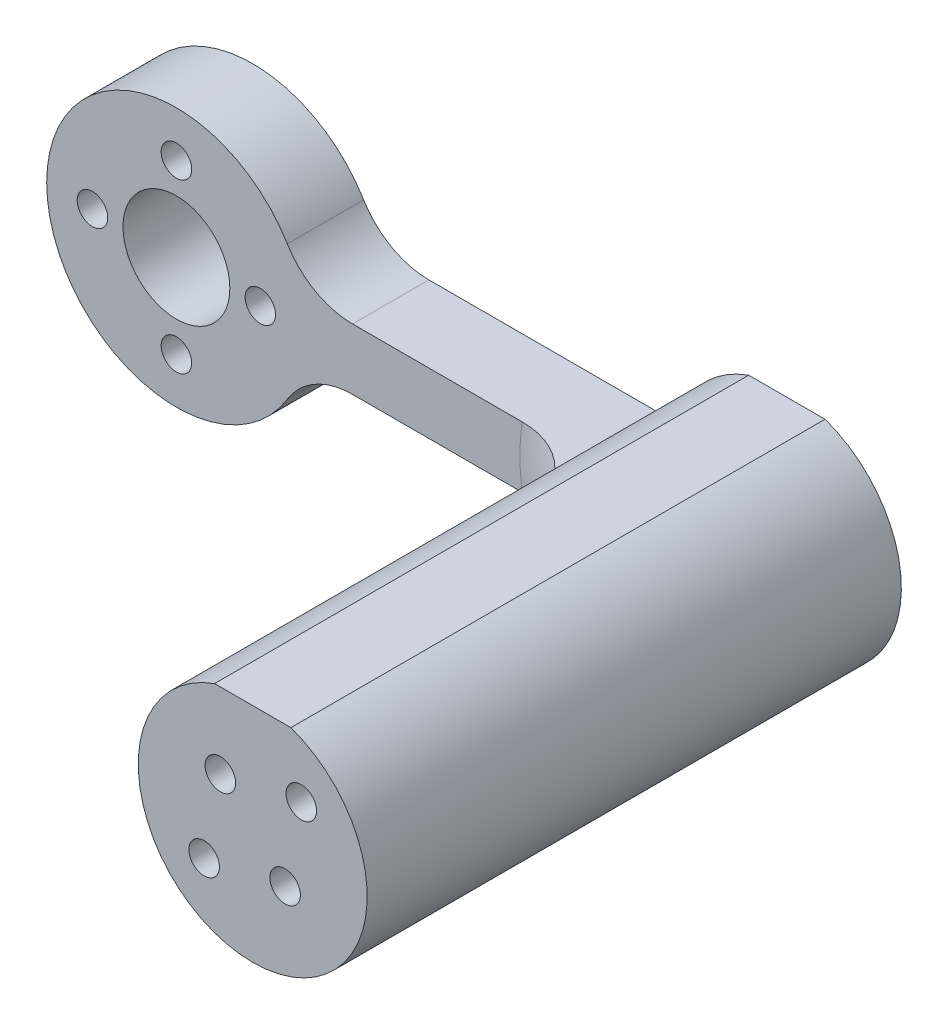
ISO-10303-21;
HEADER;
FILE_DESCRIPTION(('STEP AP214'),'2;1');
FILE_NAME('part.step','',(''),(''),'','','');
FILE_SCHEMA(('AUTOMOTIVE_DESIGN { 1 0 10303 214 1 1 1 1 }'));
ENDSEC;
DATA;
#1=APPLICATION_CONTEXT('core data for automotive mechanical design processes');
#2=APPLICATION_PROTOCOL_DEFINITION('international standard','automotive_design',2000,#1);
#3=PRODUCT_CONTEXT('',#1,'mechanical');
#4=PRODUCT('Part','Part','',(#3));
#5=PRODUCT_RELATED_PRODUCT_CATEGORY('part','',(#4));
#6=PRODUCT_DEFINITION_FORMATION('','',#4);
#7=PRODUCT_DEFINITION_CONTEXT('part definition',#1,'design');
#8=PRODUCT_DEFINITION('design','',#6,#7);
#9=PRODUCT_DEFINITION_SHAPE('','',#8);
#10=(LENGTH_UNIT() NAMED_UNIT(*) SI_UNIT(.MILLI.,.METRE.));
#11=(NAMED_UNIT(*) PLANE_ANGLE_UNIT() SI_UNIT($,.RADIAN.));
#12=(NAMED_UNIT(*) SI_UNIT($,.STERADIAN.) SOLID_ANGLE_UNIT());
#13=UNCERTAINTY_MEASURE_WITH_UNIT(LENGTH_MEASURE(1.E-05),#10,'distance_accuracy_value','');
#14=(GEOMETRIC_REPRESENTATION_CONTEXT(3) GLOBAL_UNCERTAINTY_ASSIGNED_CONTEXT((#13)) GLOBAL_UNIT_ASSIGNED_CONTEXT((#10,
#11,#12)) REPRESENTATION_CONTEXT('',''));
#15=CARTESIAN_POINT('',(0.,0.,0.));
#16=DIRECTION('',(0.,0.,1.));
#17=DIRECTION('',(1.,0.,0.));
#18=AXIS2_PLACEMENT_3D('',#15,#16,#17);
#19=CARTESIAN_POINT('',(0.,0.,10.));
#20=DIRECTION('',(0.,0.,-1.));
#21=DIRECTION('',(-1.,0.,0.));
#22=AXIS2_PLACEMENT_3D('',#19,#20,#21);
#23=CYLINDRICAL_SURFACE('',#22,17.);
#24=CARTESIAN_POINT('',(0.,0.,10.));
#25=DIRECTION('',(0.,0.,1.));
#26=DIRECTION('',(1.,0.,0.));
#27=AXIS2_PLACEMENT_3D('',#24,#25,#26);
#28=CIRCLE('',#27,17.);
#29=CARTESIAN_POINT('',(14.5361287755895,8.81481481481481,10.));
#30=VERTEX_POINT('',#29);
#31=CARTESIAN_POINT('',(14.5361287755895,-8.81481481481481,10.));
#32=VERTEX_POINT('',#31);
#33=EDGE_CURVE('E277',#30,#32,#28,.T.);
#34=ORIENTED_EDGE('',*,*,#33,.F.);
#35=DIRECTION('',(0.,0.,-1.));
#36=VECTOR('',#35,1.);
#37=CARTESIAN_POINT('',(14.5361287755895,8.81481481481481,10.));
#38=LINE('',#37,#36);
#39=CARTESIAN_POINT('',(14.5361287755895,8.81481481481481,0.));
#40=VERTEX_POINT('',#39);
#41=EDGE_CURVE('E260',#30,#40,#38,.T.);
#42=ORIENTED_EDGE('',*,*,#41,.T.);
#43=CARTESIAN_POINT('',(0.,0.,0.));
#44=DIRECTION('',(0.,0.,1.));
#45=DIRECTION('',(1.,0.,0.));
#46=AXIS2_PLACEMENT_3D('',#43,#44,#45);
#47=CIRCLE('',#46,17.);
#48=CARTESIAN_POINT('',(14.5361287755895,-8.81481481481481,0.));
#49=VERTEX_POINT('',#48);
#50=EDGE_CURVE('E140',#40,#49,#47,.T.);
#51=ORIENTED_EDGE('',*,*,#50,.T.);
#52=DIRECTION('',(0.,0.,-1.));
#53=VECTOR('',#52,1.);
#54=CARTESIAN_POINT('',(14.5361287755895,-8.81481481481481,10.));
#55=LINE('',#54,#53);
#56=EDGE_CURVE('E258',#49,#32,#55,.F.);
#57=ORIENTED_EDGE('',*,*,#56,.T.);
#58=EDGE_LOOP('',(#34,#42,#51,#57));
#59=FACE_BOUND('',#58,.T.);
#60=ADVANCED_FACE('F41',(#59),#23,.T.);
#61=CARTESIAN_POINT('',(0.,-4.,10.));
#62=DIRECTION('',(0.,1.,0.));
#63=DIRECTION('',(0.,0.,1.));
#64=AXIS2_PLACEMENT_3D('',#61,#62,#63);
#65=PLANE('',#64);
#66=DIRECTION('',(1.,0.,0.));
#67=VECTOR('',#66,1.);
#68=CARTESIAN_POINT('',(0.,-4.,10.));
#69=LINE('',#68,#67);
#70=CARTESIAN_POINT('',(23.0867927612304,-4.,10.));
#71=VERTEX_POINT('',#70);
#72=CARTESIAN_POINT('',(45.3220746414938,-4.,10.));
#73=VERTEX_POINT('',#72);
#74=EDGE_CURVE('E276',#71,#73,#69,.T.);
#75=ORIENTED_EDGE('',*,*,#74,.F.);
#76=DIRECTION('',(0.,0.,1.));
#77=VECTOR('',#76,1.);
#78=CARTESIAN_POINT('',(23.0867927612304,-4.,0.));
#79=LINE('',#78,#77);
#80=CARTESIAN_POINT('',(23.0867927612304,-4.,0.));
#81=VERTEX_POINT('',#80);
#82=EDGE_CURVE('E266',#71,#81,#79,.F.);
#83=ORIENTED_EDGE('',*,*,#82,.T.);
#84=DIRECTION('',(1.,0.,0.));
#85=VECTOR('',#84,1.);
#86=CARTESIAN_POINT('',(0.,-4.,0.));
#87=LINE('',#86,#85);
#88=CARTESIAN_POINT('',(55.543167705199,-4.00000000000001,0.));
#89=VERTEX_POINT('',#88);
#90=EDGE_CURVE('E138',#81,#89,#87,.T.);
#91=ORIENTED_EDGE('',*,*,#90,.T.);
#92=DIRECTION('',(0.,0.,-1.));
#93=VECTOR('',#92,1.);
#94=CARTESIAN_POINT('',(55.543167705199,-4.00000000000001,10.));
#95=LINE('',#94,#93);
#96=CARTESIAN_POINT('',(55.543167705199,-4.00000000000002,20.));
#97=VERTEX_POINT('',#96);
#98=EDGE_CURVE('E160',#97,#89,#95,.T.);
#99=ORIENTED_EDGE('',*,*,#98,.F.);
#100=CARTESIAN_POINT('',(55.543167705199,-4.00000000000002,20.));
#101=CARTESIAN_POINT('',(55.5432087449447,-4.00000000000001,19.7248228201258));
#102=CARTESIAN_POINT('',(55.5313843054158,-4.,19.4496563604906));
#103=CARTESIAN_POINT('',(55.4843057856862,-4.,18.9013784453921));
#104=CARTESIAN_POINT('',(55.4490555208303,-4.,18.6282666626093));
#105=CARTESIAN_POINT('',(55.3555207167676,-4.,18.0865864588528));
#106=CARTESIAN_POINT('',(55.297282684341,-4.,17.8180099993891));
#107=CARTESIAN_POINT('',(55.1583358704856,-4.,17.2867350727037));
#108=CARTESIAN_POINT('',(55.0776268110025,-4.,17.02403667826));
#109=CARTESIAN_POINT('',(54.8944992849666,-4.,16.5064127151429));
#110=CARTESIAN_POINT('',(54.792087302453,-4.,16.2514848508817));
#111=CARTESIAN_POINT('',(54.5663911555151,-4.,15.7509349786356));
#112=CARTESIAN_POINT('',(54.4430992887236,-4.,15.505316445832));
#113=CARTESIAN_POINT('',(54.1766885909717,-4.,15.0250785043264));
#114=CARTESIAN_POINT('',(54.0335694112606,-4.,14.7904592891932));
#115=CARTESIAN_POINT('',(53.7286257427785,-4.,14.3337002611693));
#116=CARTESIAN_POINT('',(53.5668003306246,-4.,14.1115610651261));
#117=CARTESIAN_POINT('',(53.2221724175061,-4.,13.6767489502417));
#118=CARTESIAN_POINT('',(53.039008900197,-4.,13.4643621422836));
#119=CARTESIAN_POINT('',(52.6558344622375,-4.,13.055375534902));
#120=CARTESIAN_POINT('',(52.4558233398176,-4.,12.8587759246035));
#121=CARTESIAN_POINT('',(52.0403418919247,-4.,12.4825608412591));
#122=CARTESIAN_POINT('',(51.8248681932299,-4.,12.3029490941134));
#123=CARTESIAN_POINT('',(51.3800007236259,-4.,11.9618900980499));
#124=CARTESIAN_POINT('',(51.1506069625836,-4.,11.8004428362567));
#125=CARTESIAN_POINT('',(50.6727665807411,-4.,11.4924240803305));
#126=CARTESIAN_POINT('',(50.4239641542808,-4.,11.3464041764122));
#127=CARTESIAN_POINT('',(49.9151283946834,-4.,11.0756910503394));
#128=CARTESIAN_POINT('',(49.6550988164515,-4.,10.9509907660192));
#129=CARTESIAN_POINT('',(49.1255786539551,-4.,10.7237379993877));
#130=CARTESIAN_POINT('',(48.8560898598838,-4.,10.6211813523012));
#131=CARTESIAN_POINT('',(48.309599607854,-4.,10.4389397848931));
#132=CARTESIAN_POINT('',(48.032599710736,-4.,10.3592501519706));
#133=CARTESIAN_POINT('',(47.3550666889493,-4.,10.1947068272554));
#134=CARTESIAN_POINT('',(46.9515431689588,-4.,10.1217588959313));
#135=CARTESIAN_POINT('',(46.3424238718643,-4.,10.0487528117809));
#136=CARTESIAN_POINT('',(46.1388276502254,-4.,10.0304867876077));
#137=CARTESIAN_POINT('',(45.7308663524651,-4.,10.006110608834));
#138=CARTESIAN_POINT('',(45.526501125084,-4.,10.0000029860478));
#139=CARTESIAN_POINT('',(45.3220746414938,-4.,10.));
#140=B_SPLINE_CURVE_WITH_KNOTS('',3,(#100,#101,#102,#103,#104,#105,#106,#107,#108,#109,#110,
#111,#112,#113,#114,#115,#116,#117,#118,#119,#120,#121,#122,#123,#124,#125,#126,#127,#128,#129,
#130,#131,#132,#133,#134,#135,#136,#137,#138,#139),.UNSPECIFIED.,.F.,.F.,(4,2,2,2,2,2,2,2,2,2,2,
2,2,2,2,2,2,2,2,4),(0.,0.82526128296588,1.65038818923651,2.47385425937608,3.29733051945721,
4.12056110094424,4.94409602757533,5.76764544154328,6.59123552518368,7.4316514340272,
8.27207740924713,9.11268728734717,9.9532965696039,10.8177407422021,11.6818980088234,
12.5458926029034,13.4097090105987,14.6365717240162,15.2495108816763,15.8625776618662),.UNSPECIFIED.);
#141=EDGE_CURVE('E169',#97,#73,#140,.T.);
#142=ORIENTED_EDGE('',*,*,#141,.T.);
#143=EDGE_LOOP('',(#75,#83,#91,#99,#142));
#144=FACE_BOUND('',#143,.T.);
#145=ADVANCED_FACE('F185',(#144),#65,.F.);
#146=CARTESIAN_POINT('',(70.,0.,10.));
#147=DIRECTION('',(0.,0.,-1.));
#148=DIRECTION('',(-1.,0.,0.));
#149=AXIS2_PLACEMENT_3D('',#146,#147,#148);
#150=CYLINDRICAL_SURFACE('',#149,15.0000000000001);
#151=CARTESIAN_POINT('',(70.,0.,20.));
#152=DIRECTION('',(0.,0.,1.));
#153=DIRECTION('',(1.,0.,0.));
#154=AXIS2_PLACEMENT_3D('',#151,#152,#153);
#155=CIRCLE('',#154,15.0000000000001);
#156=CARTESIAN_POINT('',(55.543167705199,4.00000000000001,20.));
#157=VERTEX_POINT('',#156);
#158=EDGE_CURVE('E164',#157,#97,#155,.T.);
#159=ORIENTED_EDGE('',*,*,#158,.T.);
#160=ORIENTED_EDGE('',*,*,#98,.T.);
#161=CARTESIAN_POINT('',(70.,0.,0.));
#162=DIRECTION('',(0.,0.,1.));
#163=DIRECTION('',(1.,0.,0.));
#164=AXIS2_PLACEMENT_3D('',#161,#162,#163);
#165=CIRCLE('',#164,15.0000000000001);
#166=CARTESIAN_POINT('',(75.,14.142135623731,0.));
#167=VERTEX_POINT('',#166);
#168=EDGE_CURVE('E137',#89,#167,#165,.T.);
#169=ORIENTED_EDGE('',*,*,#168,.T.);
#170=DIRECTION('',(0.,0.,1.));
#171=VECTOR('',#170,1.);
#172=CARTESIAN_POINT('',(75.,14.142135623731,0.));
#173=LINE('',#172,#171);
#174=CARTESIAN_POINT('',(75.,14.142135623731,70.));
#175=VERTEX_POINT('',#174);
#176=EDGE_CURVE('E116',#167,#175,#173,.T.);
#177=ORIENTED_EDGE('',*,*,#176,.T.);
#178=CARTESIAN_POINT('',(70.,0.,70.));
#179=DIRECTION('',(0.,0.,1.));
#180=DIRECTION('',(1.,0.,0.));
#181=AXIS2_PLACEMENT_3D('',#178,#179,#180);
#182=CIRCLE('',#181,15.0000000000001);
#183=CARTESIAN_POINT('',(65.,14.142135623731,70.));
#184=VERTEX_POINT('',#183);
#185=EDGE_CURVE('E131',#184,#175,#182,.T.);
#186=ORIENTED_EDGE('',*,*,#185,.F.);
#187=DIRECTION('',(0.,0.,1.));
#188=VECTOR('',#187,1.);
#189=CARTESIAN_POINT('',(65.,14.142135623731,0.));
#190=LINE('',#189,#188);
#191=CARTESIAN_POINT('',(65.,14.142135623731,0.));
#192=VERTEX_POINT('',#191);
#193=EDGE_CURVE('E113',#192,#184,#190,.T.);
#194=ORIENTED_EDGE('',*,*,#193,.F.);
#195=CARTESIAN_POINT('',(55.543167705199,4.00000000000001,0.));
#196=VERTEX_POINT('',#195);
#197=EDGE_CURVE('E128',#192,#196,#165,.T.);
#198=ORIENTED_EDGE('',*,*,#197,.T.);
#199=DIRECTION('',(0.,0.,-1.));
#200=VECTOR('',#199,1.);
#201=CARTESIAN_POINT('',(55.543167705199,4.00000000000001,10.));
#202=LINE('',#201,#200);
#203=EDGE_CURVE('E158',#157,#196,#202,.T.);
#204=ORIENTED_EDGE('',*,*,#203,.F.);
#205=EDGE_LOOP('',(#159,#160,#169,#177,#186,#194,#198,#204));
#206=FACE_BOUND('',#205,.T.);
#207=ADVANCED_FACE('F127',(#206),#150,.T.);
#208=CARTESIAN_POINT('',(74.2426406871193,-4.24264068711928,10.));
#209=DIRECTION('',(0.,0.,-1.));
#210=DIRECTION('',(-1.,0.,0.));
#211=AXIS2_PLACEMENT_3D('',#208,#209,#210);
#212=CYLINDRICAL_SURFACE('',#211,2.);
#213=CARTESIAN_POINT('',(74.2426406871193,-4.24264068711928,0.));
#214=DIRECTION('',(0.,0.,1.));
#215=DIRECTION('',(1.,0.,0.));
#216=AXIS2_PLACEMENT_3D('',#213,#214,#215);
#217=CIRCLE('',#216,2.);
#218=CARTESIAN_POINT('',(76.2426406871193,-4.24264068711928,0.));
#219=VERTEX_POINT('',#218);
#220=EDGE_CURVE('E151',#219,#219,#217,.T.);
#221=ORIENTED_EDGE('',*,*,#220,.F.);
#222=EDGE_LOOP('',(#221));
#223=FACE_BOUND('',#222,.T.);
#224=CARTESIAN_POINT('',(74.2426406871193,-4.24264068711928,70.));
#225=DIRECTION('',(0.,0.,1.));
#226=DIRECTION('',(1.,0.,0.));
#227=AXIS2_PLACEMENT_3D('',#224,#225,#226);
#228=CIRCLE('',#227,2.);
#229=CARTESIAN_POINT('',(76.2426406871193,-4.24264068711928,70.));
#230=VERTEX_POINT('',#229);
#231=EDGE_CURVE('E297',#230,#230,#228,.T.);
#232=ORIENTED_EDGE('',*,*,#231,.T.);
#233=EDGE_LOOP('',(#232));
#234=FACE_BOUND('',#233,.T.);
#235=ADVANCED_FACE('F331',(#223,#234),#212,.F.);
#236=CARTESIAN_POINT('',(63.6360389693211,-6.36396103067893,10.));
#237=DIRECTION('',(0.,0.,-1.));
#238=DIRECTION('',(-1.,0.,0.));
#239=AXIS2_PLACEMENT_3D('',#236,#237,#238);
#240=CYLINDRICAL_SURFACE('',#239,2.);
#241=CARTESIAN_POINT('',(63.6360389693211,-6.36396103067893,0.));
#242=DIRECTION('',(0.,0.,1.));
#243=DIRECTION('',(1.,0.,0.));
#244=AXIS2_PLACEMENT_3D('',#241,#242,#243);
#245=CIRCLE('',#244,2.);
#246=CARTESIAN_POINT('',(65.6360389693211,-6.36396103067893,0.));
#247=VERTEX_POINT('',#246);
#248=EDGE_CURVE('E148',#247,#247,#245,.T.);
#249=ORIENTED_EDGE('',*,*,#248,.F.);
#250=EDGE_LOOP('',(#249));
#251=FACE_BOUND('',#250,.T.);
#252=CARTESIAN_POINT('',(63.6360389693211,-6.36396103067893,70.));
#253=DIRECTION('',(0.,0.,1.));
#254=DIRECTION('',(1.,0.,0.));
#255=AXIS2_PLACEMENT_3D('',#252,#253,#254);
#256=CIRCLE('',#255,2.);
#257=CARTESIAN_POINT('',(65.6360389693211,-6.36396103067893,70.));
#258=VERTEX_POINT('',#257);
#259=EDGE_CURVE('E294',#258,#258,#256,.T.);
#260=ORIENTED_EDGE('',*,*,#259,.T.);
#261=EDGE_LOOP('',(#260));
#262=FACE_BOUND('',#261,.T.);
#263=ADVANCED_FACE('F322',(#251,#262),#240,.F.);
#264=CARTESIAN_POINT('',(65.7573593128807,4.24264068711929,10.));
#265=DIRECTION('',(0.,0.,-1.));
#266=DIRECTION('',(-1.,0.,0.));
#267=AXIS2_PLACEMENT_3D('',#264,#265,#266);
#268=CYLINDRICAL_SURFACE('',#267,2.);
#269=CARTESIAN_POINT('',(65.7573593128807,4.24264068711929,0.));
#270=DIRECTION('',(0.,0.,1.));
#271=DIRECTION('',(1.,0.,0.));
#272=AXIS2_PLACEMENT_3D('',#269,#270,#271);
#273=CIRCLE('',#272,2.);
#274=CARTESIAN_POINT('',(67.7573593128807,4.24264068711929,0.));
#275=VERTEX_POINT('',#274);
#276=EDGE_CURVE('E145',#275,#275,#273,.T.);
#277=ORIENTED_EDGE('',*,*,#276,.F.);
#278=EDGE_LOOP('',(#277));
#279=FACE_BOUND('',#278,.T.);
#280=CARTESIAN_POINT('',(65.7573593128807,4.24264068711929,70.));
#281=DIRECTION('',(0.,0.,1.));
#282=DIRECTION('',(1.,0.,0.));
#283=AXIS2_PLACEMENT_3D('',#280,#281,#282);
#284=CIRCLE('',#283,2.);
#285=CARTESIAN_POINT('',(67.7573593128807,4.24264068711929,70.));
#286=VERTEX_POINT('',#285);
#287=EDGE_CURVE('E303',#286,#286,#284,.T.);
#288=ORIENTED_EDGE('',*,*,#287,.T.);
#289=EDGE_LOOP('',(#288));
#290=FACE_BOUND('',#289,.T.);
#291=ADVANCED_FACE('F320',(#279,#290),#268,.F.);
#292=CARTESIAN_POINT('',(0.,4.,10.));
#293=DIRECTION('',(0.,1.,0.));
#294=DIRECTION('',(0.,0.,1.));
#295=AXIS2_PLACEMENT_3D('',#292,#293,#294);
#296=PLANE('',#295);
#297=DIRECTION('',(1.,0.,0.));
#298=VECTOR('',#297,1.);
#299=CARTESIAN_POINT('',(0.,4.,0.));
#300=LINE('',#299,#298);
#301=CARTESIAN_POINT('',(23.0867927612304,4.,0.));
#302=VERTEX_POINT('',#301);
#303=EDGE_CURVE('E136',#302,#196,#300,.T.);
#304=ORIENTED_EDGE('',*,*,#303,.F.);
#305=DIRECTION('',(0.,0.,-1.));
#306=VECTOR('',#305,1.);
#307=CARTESIAN_POINT('',(23.0867927612304,4.,10.));
#308=LINE('',#307,#306);
#309=CARTESIAN_POINT('',(23.0867927612304,4.,10.));
#310=VERTEX_POINT('',#309);
#311=EDGE_CURVE('E261',#302,#310,#308,.F.);
#312=ORIENTED_EDGE('',*,*,#311,.T.);
#313=DIRECTION('',(1.,0.,0.));
#314=VECTOR('',#313,1.);
#315=CARTESIAN_POINT('',(0.,4.,10.));
#316=LINE('',#315,#314);
#317=CARTESIAN_POINT('',(45.3220746414938,4.,10.));
#318=VERTEX_POINT('',#317);
#319=EDGE_CURVE('E161',#310,#318,#316,.T.);
#320=ORIENTED_EDGE('',*,*,#319,.T.);
#321=CARTESIAN_POINT('',(45.3220746414938,4.,10.));
#322=CARTESIAN_POINT('',(45.6124141063794,4.,9.99997007441533));
#323=CARTESIAN_POINT('',(45.9027435054448,4.,10.0123195296123));
#324=CARTESIAN_POINT('',(46.4812989688808,4.,10.0614910512002));
#325=CARTESIAN_POINT('',(46.7695252110759,4.,10.0983110237587));
#326=CARTESIAN_POINT('',(47.3416099272991,4.,10.196097931904));
#327=CARTESIAN_POINT('',(47.6254717477473,4.,10.25704529898));
#328=CARTESIAN_POINT('',(48.1870615965594,4.,10.4026010874903));
#329=CARTESIAN_POINT('',(48.4647896251705,4.,10.4872095079713));
#330=CARTESIAN_POINT('',(49.0122335736802,4.,10.6794901264012));
#331=CARTESIAN_POINT('',(49.2819471473328,4.,10.7871690039776));
#332=CARTESIAN_POINT('',(49.8113807994817,4.,11.0248066556983));
#333=CARTESIAN_POINT('',(50.0711006601882,4.,11.1547659150557));
#334=CARTESIAN_POINT('',(50.5786777919108,4.,11.4360446757581));
#335=CARTESIAN_POINT('',(50.8265360090532,4.,11.587362469656));
#336=CARTESIAN_POINT('',(51.3086328831607,4.,11.9103290332859));
#337=CARTESIAN_POINT('',(51.5428715869938,4.,12.0819777330481));
#338=CARTESIAN_POINT('',(51.9964360712436,4.,12.4447787266729));
#339=CARTESIAN_POINT('',(52.2157336135903,4.,12.6359663322982));
#340=CARTESIAN_POINT('',(52.637287343327,4.,13.0362863494393));
#341=CARTESIAN_POINT('',(52.8395437583312,4.,13.2454185211986));
#342=CARTESIAN_POINT('',(53.2254828859551,4.,13.6802579560597));
#343=CARTESIAN_POINT('',(53.4091615728944,4.,13.9059687934438));
#344=CARTESIAN_POINT('',(53.756394098902,4.,14.3723693739591));
#345=CARTESIAN_POINT('',(53.9199486220086,4.,14.6130586075423));
#346=CARTESIAN_POINT('',(54.2234039409139,4.,15.1042797989338));
#347=CARTESIAN_POINT('',(54.363603170859,4.,15.3546273579926));
#348=CARTESIAN_POINT('',(54.6218440697586,4.,15.8664907550712));
#349=CARTESIAN_POINT('',(54.7398869083554,4.,16.1280060026502));
#350=CARTESIAN_POINT('',(54.9526346977016,4.,16.660105088885));
#351=CARTESIAN_POINT('',(55.0473604478056,4.,16.9306805989909));
#352=CARTESIAN_POINT('',(55.2126597704956,4.,17.4789913874446));
#353=CARTESIAN_POINT('',(55.2832413492745,4.,17.7567242595009));
#354=CARTESIAN_POINT('',(55.4083850141086,4.,18.3598589918117));
#355=CARTESIAN_POINT('',(55.4589086924961,4.,18.6861164393588));
#356=CARTESIAN_POINT('',(55.5094486774166,4.,19.1777576605762));
#357=CARTESIAN_POINT('',(55.5220877332056,4.,19.3419407556353));
#358=CARTESIAN_POINT('',(55.5389473563745,4.,19.6707384505523));
#359=CARTESIAN_POINT('',(55.5431679303783,4.,19.8353530500707));
#360=CARTESIAN_POINT('',(55.543167705199,4.,20.));
#361=B_SPLINE_CURVE_WITH_KNOTS('',3,(#321,#322,#323,#324,#325,#326,#327,#328,#329,#330,#331,
#332,#333,#334,#335,#336,#337,#338,#339,#340,#341,#342,#343,#344,#345,#346,#347,#348,#349,#350,
#351,#352,#353,#354,#355,#356,#357,#358,#359,#360),.UNSPECIFIED.,.F.,.F.,(4,2,2,2,2,2,2,2,2,2,2,
2,2,2,2,2,2,2,2,4),(0.,0.870741459217907,1.74140842258424,2.6113706739706,3.48133289030778,
4.3515473294442,5.22178072216279,6.09194458591756,6.96210545504787,7.83386770989839,
8.70561831898779,9.57755742820579,10.4494668912355,11.3091998440429,12.1688873985245,
13.0278052910078,13.8864380901042,14.8749573768362,15.3687801525789,15.8626025397706),.UNSPECIFIED.);
#362=EDGE_CURVE('E178',#318,#157,#361,.T.);
#363=ORIENTED_EDGE('',*,*,#362,.T.);
#364=ORIENTED_EDGE('',*,*,#203,.T.);
#365=EDGE_LOOP('',(#304,#312,#320,#363,#364));
#366=FACE_BOUND('',#365,.T.);
#367=ADVANCED_FACE('F217',(#366),#296,.T.);
#368=CARTESIAN_POINT('',(0.,11.,10.));
#369=DIRECTION('',(0.,0.,-1.));
#370=DIRECTION('',(-1.,0.,0.));
#371=AXIS2_PLACEMENT_3D('',#368,#369,#370);
#372=CYLINDRICAL_SURFACE('',#371,2.);
#373=CARTESIAN_POINT('',(0.,11.,10.));
#374=DIRECTION('',(0.,0.,1.));
#375=DIRECTION('',(1.,0.,0.));
#376=AXIS2_PLACEMENT_3D('',#373,#374,#375);
#377=CIRCLE('',#376,2.);
#378=CARTESIAN_POINT('',(2.,11.,10.));
#379=VERTEX_POINT('',#378);
#380=EDGE_CURVE('E279',#379,#379,#377,.T.);
#381=ORIENTED_EDGE('',*,*,#380,.T.);
#382=EDGE_LOOP('',(#381));
#383=FACE_BOUND('',#382,.T.);
#384=CARTESIAN_POINT('',(0.,11.,0.));
#385=DIRECTION('',(0.,0.,1.));
#386=DIRECTION('',(1.,0.,0.));
#387=AXIS2_PLACEMENT_3D('',#384,#385,#386);
#388=CIRCLE('',#387,2.);
#389=CARTESIAN_POINT('',(2.,11.,0.));
#390=VERTEX_POINT('',#389);
#391=EDGE_CURVE('E253',#390,#390,#388,.T.);
#392=ORIENTED_EDGE('',*,*,#391,.F.);
#393=EDGE_LOOP('',(#392));
#394=FACE_BOUND('',#393,.T.);
#395=ADVANCED_FACE('F213',(#383,#394),#372,.F.);
#396=CARTESIAN_POINT('',(11.,0.,10.));
#397=DIRECTION('',(0.,0.,-1.));
#398=DIRECTION('',(-1.,0.,0.));
#399=AXIS2_PLACEMENT_3D('',#396,#397,#398);
#400=CYLINDRICAL_SURFACE('',#399,2.);
#401=CARTESIAN_POINT('',(11.,0.,10.));
#402=DIRECTION('',(0.,0.,1.));
#403=DIRECTION('',(1.,0.,0.));
#404=AXIS2_PLACEMENT_3D('',#401,#402,#403);
#405=CIRCLE('',#404,2.);
#406=CARTESIAN_POINT('',(13.,0.,10.));
#407=VERTEX_POINT('',#406);
#408=EDGE_CURVE('E284',#407,#407,#405,.T.);
#409=ORIENTED_EDGE('',*,*,#408,.T.);
#410=EDGE_LOOP('',(#409));
#411=FACE_BOUND('',#410,.T.);
#412=CARTESIAN_POINT('',(11.,0.,0.));
#413=DIRECTION('',(0.,0.,1.));
#414=DIRECTION('',(1.,0.,0.));
#415=AXIS2_PLACEMENT_3D('',#412,#413,#414);
#416=CIRCLE('',#415,2.);
#417=CARTESIAN_POINT('',(13.,0.,0.));
#418=VERTEX_POINT('',#417);
#419=EDGE_CURVE('E245',#418,#418,#416,.T.);
#420=ORIENTED_EDGE('',*,*,#419,.F.);
#421=EDGE_LOOP('',(#420));
#422=FACE_BOUND('',#421,.T.);
#423=ADVANCED_FACE('F216',(#411,#422),#400,.F.);
#424=CARTESIAN_POINT('',(0.,-11.,10.));
#425=DIRECTION('',(0.,0.,-1.));
#426=DIRECTION('',(-1.,0.,0.));
#427=AXIS2_PLACEMENT_3D('',#424,#425,#426);
#428=CYLINDRICAL_SURFACE('',#427,2.);
#429=CARTESIAN_POINT('',(0.,-11.,10.));
#430=DIRECTION('',(0.,0.,1.));
#431=DIRECTION('',(1.,0.,0.));
#432=AXIS2_PLACEMENT_3D('',#429,#430,#431);
#433=CIRCLE('',#432,2.);
#434=CARTESIAN_POINT('',(2.,-11.,10.));
#435=VERTEX_POINT('',#434);
#436=EDGE_CURVE('E287',#435,#435,#433,.T.);
#437=ORIENTED_EDGE('',*,*,#436,.T.);
#438=EDGE_LOOP('',(#437));
#439=FACE_BOUND('',#438,.T.);
#440=CARTESIAN_POINT('',(0.,-11.,0.));
#441=DIRECTION('',(0.,0.,1.));
#442=DIRECTION('',(1.,0.,0.));
#443=AXIS2_PLACEMENT_3D('',#440,#441,#442);
#444=CIRCLE('',#443,2.);
#445=CARTESIAN_POINT('',(2.,-11.,0.));
#446=VERTEX_POINT('',#445);
#447=EDGE_CURVE('E241',#446,#446,#444,.T.);
#448=ORIENTED_EDGE('',*,*,#447,.F.);
#449=EDGE_LOOP('',(#448));
#450=FACE_BOUND('',#449,.T.);
#451=ADVANCED_FACE('F221',(#439,#450),#428,.F.);
#452=CARTESIAN_POINT('',(-11.,0.,10.));
#453=DIRECTION('',(0.,0.,-1.));
#454=DIRECTION('',(-1.,0.,0.));
#455=AXIS2_PLACEMENT_3D('',#452,#453,#454);
#456=CYLINDRICAL_SURFACE('',#455,2.);
#457=CARTESIAN_POINT('',(-11.,0.,10.));
#458=DIRECTION('',(0.,0.,1.));
#459=DIRECTION('',(1.,0.,0.));
#460=AXIS2_PLACEMENT_3D('',#457,#458,#459);
#461=CIRCLE('',#460,2.);
#462=CARTESIAN_POINT('',(-9.,0.,10.));
#463=VERTEX_POINT('',#462);
#464=EDGE_CURVE('E236',#463,#463,#461,.T.);
#465=ORIENTED_EDGE('',*,*,#464,.T.);
#466=EDGE_LOOP('',(#465));
#467=FACE_BOUND('',#466,.T.);
#468=CARTESIAN_POINT('',(-11.,0.,0.));
#469=DIRECTION('',(0.,0.,1.));
#470=DIRECTION('',(1.,0.,0.));
#471=AXIS2_PLACEMENT_3D('',#468,#469,#470);
#472=CIRCLE('',#471,2.);
#473=CARTESIAN_POINT('',(-9.,0.,0.));
#474=VERTEX_POINT('',#473);
#475=EDGE_CURVE('E239',#474,#474,#472,.T.);
#476=ORIENTED_EDGE('',*,*,#475,.F.);
#477=EDGE_LOOP('',(#476));
#478=FACE_BOUND('',#477,.T.);
#479=ADVANCED_FACE('F224',(#467,#478),#456,.F.);
#480=CARTESIAN_POINT('',(0.,0.,10.));
#481=DIRECTION('',(0.,0.,-1.));
#482=DIRECTION('',(-1.,0.,0.));
#483=AXIS2_PLACEMENT_3D('',#480,#481,#482);
#484=CYLINDRICAL_SURFACE('',#483,7.);
#485=CARTESIAN_POINT('',(0.,0.,10.));
#486=DIRECTION('',(0.,0.,1.));
#487=DIRECTION('',(1.,0.,0.));
#488=AXIS2_PLACEMENT_3D('',#485,#486,#487);
#489=CIRCLE('',#488,7.);
#490=CARTESIAN_POINT('',(7.,0.,10.));
#491=VERTEX_POINT('',#490);
#492=EDGE_CURVE('E157',#491,#491,#489,.T.);
#493=ORIENTED_EDGE('',*,*,#492,.T.);
#494=EDGE_LOOP('',(#493));
#495=FACE_BOUND('',#494,.T.);
#496=CARTESIAN_POINT('',(0.,0.,0.));
#497=DIRECTION('',(0.,0.,1.));
#498=DIRECTION('',(1.,0.,0.));
#499=AXIS2_PLACEMENT_3D('',#496,#497,#498);
#500=CIRCLE('',#499,7.);
#501=CARTESIAN_POINT('',(7.,0.,0.));
#502=VERTEX_POINT('',#501);
#503=EDGE_CURVE('E242',#502,#502,#500,.T.);
#504=ORIENTED_EDGE('',*,*,#503,.F.);
#505=EDGE_LOOP('',(#504));
#506=FACE_BOUND('',#505,.T.);
#507=ADVANCED_FACE('F195',(#495,#506),#484,.F.);
#508=CARTESIAN_POINT('',(76.3639610306789,6.36396103067893,10.));
#509=DIRECTION('',(0.,0.,-1.));
#510=DIRECTION('',(-1.,0.,0.));
#511=AXIS2_PLACEMENT_3D('',#508,#509,#510);
#512=CYLINDRICAL_SURFACE('',#511,2.);
#513=CARTESIAN_POINT('',(76.3639610306789,6.36396103067893,0.));
#514=DIRECTION('',(0.,0.,1.));
#515=DIRECTION('',(1.,0.,0.));
#516=AXIS2_PLACEMENT_3D('',#513,#514,#515);
#517=CIRCLE('',#516,2.);
#518=CARTESIAN_POINT('',(78.3639610306789,6.36396103067893,0.));
#519=VERTEX_POINT('',#518);
#520=EDGE_CURVE('E154',#519,#519,#517,.T.);
#521=ORIENTED_EDGE('',*,*,#520,.F.);
#522=EDGE_LOOP('',(#521));
#523=FACE_BOUND('',#522,.T.);
#524=CARTESIAN_POINT('',(76.3639610306789,6.36396103067893,70.));
#525=DIRECTION('',(0.,0.,1.));
#526=DIRECTION('',(1.,0.,0.));
#527=AXIS2_PLACEMENT_3D('',#524,#525,#526);
#528=CIRCLE('',#527,2.);
#529=CARTESIAN_POINT('',(78.3639610306789,6.36396103067893,70.));
#530=VERTEX_POINT('',#529);
#531=EDGE_CURVE('E300',#530,#530,#528,.T.);
#532=ORIENTED_EDGE('',*,*,#531,.T.);
#533=EDGE_LOOP('',(#532));
#534=FACE_BOUND('',#533,.T.);
#535=ADVANCED_FACE('F231',(#523,#534),#512,.F.);
#536=CARTESIAN_POINT('',(0.,0.,10.));
#537=DIRECTION('',(0.,0.,1.));
#538=DIRECTION('',(1.,0.,0.));
#539=AXIS2_PLACEMENT_3D('',#536,#537,#538);
#540=PLANE('',#539);
#541=ORIENTED_EDGE('',*,*,#33,.T.);
#542=CARTESIAN_POINT('',(23.0867927612304,-14.,10.));
#543=DIRECTION('',(0.,0.,1.));
#544=DIRECTION('',(1.,0.,0.));
#545=AXIS2_PLACEMENT_3D('',#542,#543,#544);
#546=CIRCLE('',#545,10.);
#547=EDGE_CURVE('E11',#32,#71,#546,.F.);
#548=ORIENTED_EDGE('',*,*,#547,.T.);
#549=ORIENTED_EDGE('',*,*,#74,.T.);
#550=CARTESIAN_POINT('',(70.,0.,10.));
#551=DIRECTION('',(0.,0.,1.));
#552=DIRECTION('',(1.,0.,0.));
#553=AXIS2_PLACEMENT_3D('',#550,#551,#552);
#554=CIRCLE('',#553,25.0000000000001);
#555=EDGE_CURVE('E166',#73,#318,#554,.F.);
#556=ORIENTED_EDGE('',*,*,#555,.T.);
#557=ORIENTED_EDGE('',*,*,#319,.F.);
#558=CARTESIAN_POINT('',(23.0867927612304,14.,10.));
#559=DIRECTION('',(0.,0.,1.));
#560=DIRECTION('',(1.,0.,0.));
#561=AXIS2_PLACEMENT_3D('',#558,#559,#560);
#562=CIRCLE('',#561,10.);
#563=EDGE_CURVE('E270',#310,#30,#562,.F.);
#564=ORIENTED_EDGE('',*,*,#563,.T.);
#565=EDGE_LOOP('',(#541,#548,#549,#556,#557,#564));
#566=FACE_BOUND('',#565,.T.);
#567=ORIENTED_EDGE('',*,*,#492,.F.);
#568=EDGE_LOOP('',(#567));
#569=FACE_BOUND('',#568,.T.);
#570=ORIENTED_EDGE('',*,*,#464,.F.);
#571=EDGE_LOOP('',(#570));
#572=FACE_BOUND('',#571,.T.);
#573=ORIENTED_EDGE('',*,*,#436,.F.);
#574=EDGE_LOOP('',(#573));
#575=FACE_BOUND('',#574,.T.);
#576=ORIENTED_EDGE('',*,*,#408,.F.);
#577=EDGE_LOOP('',(#576));
#578=FACE_BOUND('',#577,.T.);
#579=ORIENTED_EDGE('',*,*,#380,.F.);
#580=EDGE_LOOP('',(#579));
#581=FACE_BOUND('',#580,.T.);
#582=ADVANCED_FACE('F349',(#566,#569,#572,#575,#578,#581),#540,.T.);
#583=CARTESIAN_POINT('',(0.,0.,0.));
#584=DIRECTION('',(0.,0.,1.));
#585=DIRECTION('',(1.,0.,0.));
#586=AXIS2_PLACEMENT_3D('',#583,#584,#585);
#587=PLANE('',#586);
#588=ORIENTED_EDGE('',*,*,#503,.T.);
#589=EDGE_LOOP('',(#588));
#590=FACE_BOUND('',#589,.T.);
#591=ORIENTED_EDGE('',*,*,#475,.T.);
#592=EDGE_LOOP('',(#591));
#593=FACE_BOUND('',#592,.T.);
#594=ORIENTED_EDGE('',*,*,#447,.T.);
#595=EDGE_LOOP('',(#594));
#596=FACE_BOUND('',#595,.T.);
#597=ORIENTED_EDGE('',*,*,#419,.T.);
#598=EDGE_LOOP('',(#597));
#599=FACE_BOUND('',#598,.T.);
#600=ORIENTED_EDGE('',*,*,#391,.T.);
#601=EDGE_LOOP('',(#600));
#602=FACE_BOUND('',#601,.T.);
#603=ORIENTED_EDGE('',*,*,#197,.F.);
#604=DIRECTION('',(1.,0.,0.));
#605=VECTOR('',#604,1.);
#606=CARTESIAN_POINT('',(0.,14.142135623731,0.));
#607=LINE('',#606,#605);
#608=EDGE_CURVE('E110',#192,#167,#607,.T.);
#609=ORIENTED_EDGE('',*,*,#608,.T.);
#610=ORIENTED_EDGE('',*,*,#168,.F.);
#611=ORIENTED_EDGE('',*,*,#90,.F.);
#612=CARTESIAN_POINT('',(23.0867927612304,-14.,0.));
#613=DIRECTION('',(0.,0.,1.));
#614=DIRECTION('',(1.,0.,0.));
#615=AXIS2_PLACEMENT_3D('',#612,#613,#614);
#616=CIRCLE('',#615,10.);
#617=EDGE_CURVE('E49',#81,#49,#616,.T.);
#618=ORIENTED_EDGE('',*,*,#617,.T.);
#619=ORIENTED_EDGE('',*,*,#50,.F.);
#620=CARTESIAN_POINT('',(23.0867927612304,14.,0.));
#621=DIRECTION('',(0.,0.,1.));
#622=DIRECTION('',(1.,0.,0.));
#623=AXIS2_PLACEMENT_3D('',#620,#621,#622);
#624=CIRCLE('',#623,10.);
#625=EDGE_CURVE('E268',#40,#302,#624,.T.);
#626=ORIENTED_EDGE('',*,*,#625,.T.);
#627=ORIENTED_EDGE('',*,*,#303,.T.);
#628=EDGE_LOOP('',(#603,#609,#610,#611,#618,#619,#626,#627));
#629=FACE_BOUND('',#628,.T.);
#630=ORIENTED_EDGE('',*,*,#276,.T.);
#631=EDGE_LOOP('',(#630));
#632=FACE_BOUND('',#631,.T.);
#633=ORIENTED_EDGE('',*,*,#248,.T.);
#634=EDGE_LOOP('',(#633));
#635=FACE_BOUND('',#634,.T.);
#636=ORIENTED_EDGE('',*,*,#220,.T.);
#637=EDGE_LOOP('',(#636));
#638=FACE_BOUND('',#637,.T.);
#639=ORIENTED_EDGE('',*,*,#520,.T.);
#640=EDGE_LOOP('',(#639));
#641=FACE_BOUND('',#640,.T.);
#642=ADVANCED_FACE('F133',(#590,#593,#596,#599,#602,#629,#632,#635,#638,#641),#587,.F.);
#643=CARTESIAN_POINT('',(70.,0.,70.));
#644=DIRECTION('',(0.,0.,1.));
#645=DIRECTION('',(1.,0.,0.));
#646=AXIS2_PLACEMENT_3D('',#643,#644,#645);
#647=PLANE('',#646);
#648=DIRECTION('',(1.,0.,0.));
#649=VECTOR('',#648,1.);
#650=CARTESIAN_POINT('',(0.,14.142135623731,70.));
#651=LINE('',#650,#649);
#652=EDGE_CURVE('E121',#184,#175,#651,.T.);
#653=ORIENTED_EDGE('',*,*,#652,.F.);
#654=ORIENTED_EDGE('',*,*,#185,.T.);
#655=EDGE_LOOP('',(#653,#654));
#656=FACE_BOUND('',#655,.T.);
#657=ORIENTED_EDGE('',*,*,#531,.F.);
#658=EDGE_LOOP('',(#657));
#659=FACE_BOUND('',#658,.T.);
#660=ORIENTED_EDGE('',*,*,#259,.F.);
#661=EDGE_LOOP('',(#660));
#662=FACE_BOUND('',#661,.T.);
#663=ORIENTED_EDGE('',*,*,#231,.F.);
#664=EDGE_LOOP('',(#663));
#665=FACE_BOUND('',#664,.T.);
#666=ORIENTED_EDGE('',*,*,#287,.F.);
#667=EDGE_LOOP('',(#666));
#668=FACE_BOUND('',#667,.T.);
#669=ADVANCED_FACE('F308',(#656,#659,#662,#665,#668),#647,.T.);
#670=CARTESIAN_POINT('',(0.,14.142135623731,0.));
#671=DIRECTION('',(0.,-1.,0.));
#672=DIRECTION('',(0.,0.,-1.));
#673=AXIS2_PLACEMENT_3D('',#670,#671,#672);
#674=PLANE('',#673);
#675=ORIENTED_EDGE('',*,*,#652,.T.);
#676=ORIENTED_EDGE('',*,*,#176,.F.);
#677=ORIENTED_EDGE('',*,*,#608,.F.);
#678=ORIENTED_EDGE('',*,*,#193,.T.);
#679=EDGE_LOOP('',(#675,#676,#677,#678));
#680=FACE_BOUND('',#679,.T.);
#681=ADVANCED_FACE('F112',(#680),#674,.F.);
#682=CARTESIAN_POINT('',(70.,0.,20.));
#683=DIRECTION('',(0.,0.,1.));
#684=DIRECTION('',(1.,0.,0.));
#685=AXIS2_PLACEMENT_3D('',#682,#683,#684);
#686=TOROIDAL_SURFACE('',#685,25.0000000000001,10.);
#687=ORIENTED_EDGE('',*,*,#362,.F.);
#688=ORIENTED_EDGE('',*,*,#555,.F.);
#689=ORIENTED_EDGE('',*,*,#141,.F.);
#690=ORIENTED_EDGE('',*,*,#158,.F.);
#691=EDGE_LOOP('',(#687,#688,#689,#690));
#692=FACE_BOUND('',#691,.T.);
#693=ADVANCED_FACE('F189',(#692),#686,.F.);
#694=CARTESIAN_POINT('',(23.0867927612304,14.,10.));
#695=DIRECTION('',(0.,0.,-1.));
#696=DIRECTION('',(-1.,0.,0.));
#697=AXIS2_PLACEMENT_3D('',#694,#695,#696);
#698=CYLINDRICAL_SURFACE('',#697,10.);
#699=ORIENTED_EDGE('',*,*,#563,.F.);
#700=ORIENTED_EDGE('',*,*,#311,.F.);
#701=ORIENTED_EDGE('',*,*,#625,.F.);
#702=ORIENTED_EDGE('',*,*,#41,.F.);
#703=EDGE_LOOP('',(#699,#700,#701,#702));
#704=FACE_BOUND('',#703,.T.);
#705=ADVANCED_FACE('F193',(#704),#698,.F.);
#706=CARTESIAN_POINT('',(23.0867927612304,-14.,10.));
#707=DIRECTION('',(0.,0.,-1.));
#708=DIRECTION('',(-1.,0.,0.));
#709=AXIS2_PLACEMENT_3D('',#706,#707,#708);
#710=CYLINDRICAL_SURFACE('',#709,10.);
#711=ORIENTED_EDGE('',*,*,#547,.F.);
#712=ORIENTED_EDGE('',*,*,#56,.F.);
#713=ORIENTED_EDGE('',*,*,#617,.F.);
#714=ORIENTED_EDGE('',*,*,#82,.F.);
#715=EDGE_LOOP('',(#711,#712,#713,#714));
#716=FACE_BOUND('',#715,.T.);
#717=ADVANCED_FACE('F43',(#716),#710,.F.);
#718=CLOSED_SHELL('',(#60,#145,#207,#235,#263,#291,#367,#395,#423,#451,#479,#507,#535,#582,#642,
#669,#681,#693,#705,#717));
#719=MANIFOLD_SOLID_BREP('B2',#718);
#720=ADVANCED_BREP_SHAPE_REPRESENTATION('',(#18,#719),#14);
#721=SHAPE_DEFINITION_REPRESENTATION(#9,#720);
ENDSEC;
END-ISO-10303-21;
